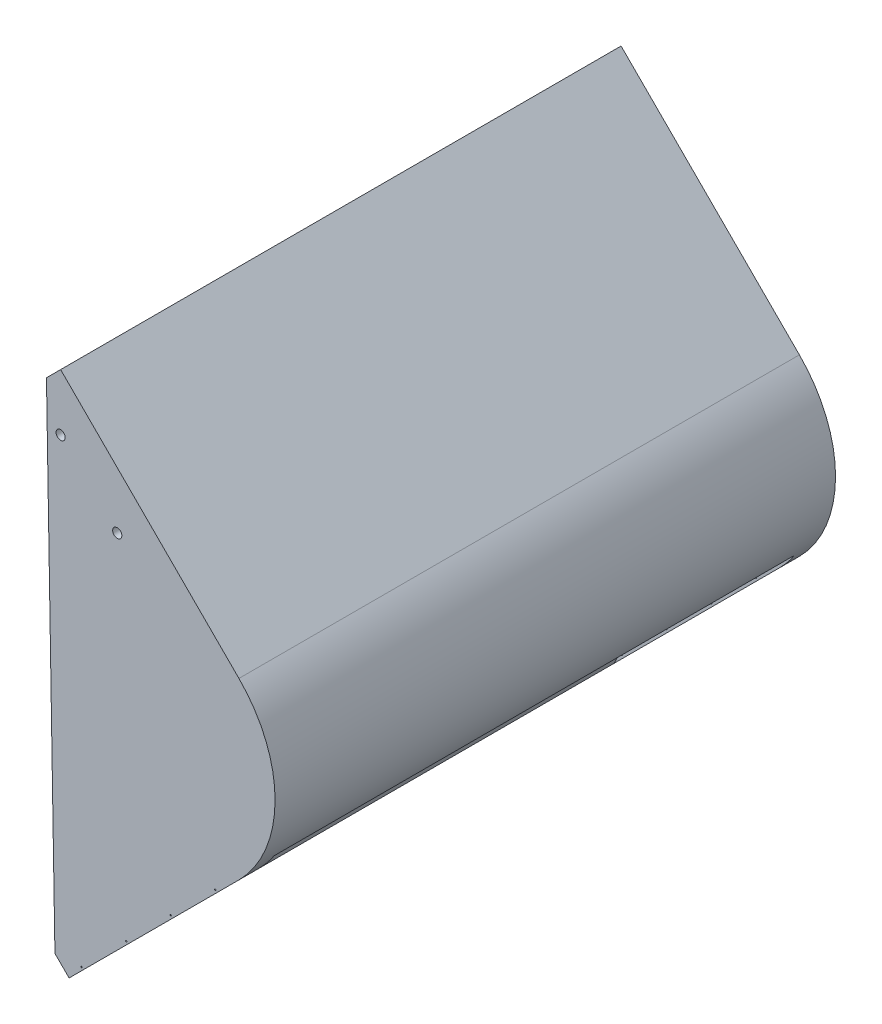
ISO-10303-21;
HEADER;
FILE_DESCRIPTION(('STEP AP214'),'2;1');
FILE_NAME('part.step','',(''),(''),'','','');
FILE_SCHEMA(('AUTOMOTIVE_DESIGN { 1 0 10303 214 1 1 1 1 }'));
ENDSEC;
DATA;
#1=APPLICATION_CONTEXT('core data for automotive mechanical design processes');
#2=APPLICATION_PROTOCOL_DEFINITION('international standard','automotive_design',2000,#1);
#3=PRODUCT_CONTEXT('',#1,'mechanical');
#4=PRODUCT('Part','Part','',(#3));
#5=PRODUCT_RELATED_PRODUCT_CATEGORY('part','',(#4));
#6=PRODUCT_DEFINITION_FORMATION('','',#4);
#7=PRODUCT_DEFINITION_CONTEXT('part definition',#1,'design');
#8=PRODUCT_DEFINITION('design','',#6,#7);
#9=PRODUCT_DEFINITION_SHAPE('','',#8);
#10=(LENGTH_UNIT() NAMED_UNIT(*) SI_UNIT(.MILLI.,.METRE.));
#11=(NAMED_UNIT(*) PLANE_ANGLE_UNIT() SI_UNIT($,.RADIAN.));
#12=(NAMED_UNIT(*) SI_UNIT($,.STERADIAN.) SOLID_ANGLE_UNIT());
#13=UNCERTAINTY_MEASURE_WITH_UNIT(LENGTH_MEASURE(1.E-05),#10,'distance_accuracy_value','');
#14=(GEOMETRIC_REPRESENTATION_CONTEXT(3) GLOBAL_UNCERTAINTY_ASSIGNED_CONTEXT((#13)) GLOBAL_UNIT_ASSIGNED_CONTEXT((#10,
#11,#12)) REPRESENTATION_CONTEXT('',''));
#15=CARTESIAN_POINT('',(0.,0.,0.));
#16=DIRECTION('',(0.,0.,1.));
#17=DIRECTION('',(1.,0.,0.));
#18=AXIS2_PLACEMENT_3D('',#15,#16,#17);
#19=CARTESIAN_POINT('',(-4.49012806053454,-37.9632412700599,177.8));
#20=DIRECTION('',(0.707106781186544,-0.707106781186551,0.));
#21=DIRECTION('',(0.707106781186551,0.707106781186544,0.));
#22=AXIS2_PLACEMENT_3D('',#19,#20,#21);
#23=PLANE('',#22);
#24=DIRECTION('',(0.,0.,1.));
#25=VECTOR('',#24,1.);
#26=CARTESIAN_POINT('',(-56.9574512245767,-90.4305644341015,177.8));
#27=LINE('',#26,#25);
#28=CARTESIAN_POINT('',(-56.9574512245767,-90.4305644341015,6.35));
#29=VERTEX_POINT('',#28);
#30=CARTESIAN_POINT('',(-56.9574512245767,-90.4305644341015,171.45));
#31=VERTEX_POINT('',#30);
#32=EDGE_CURVE('E177',#29,#31,#27,.T.);
#33=ORIENTED_EDGE('',*,*,#32,.F.);
#34=DIRECTION('',(0.707106781186551,0.707106781186544,0.));
#35=VECTOR('',#34,1.);
#36=CARTESIAN_POINT('',(16.7365566047627,-16.7365566047629,6.35));
#37=LINE('',#36,#35);
#38=CARTESIAN_POINT('',(-58.3716647869498,-91.8447779964745,6.34999999999999));
#39=VERTEX_POINT('',#38);
#40=EDGE_CURVE('E249',#39,#29,#37,.T.);
#41=ORIENTED_EDGE('',*,*,#40,.F.);
#42=DIRECTION('',(0.,0.,-1.));
#43=VECTOR('',#42,1.);
#44=CARTESIAN_POINT('',(-58.3716647869498,-91.8447779964745,177.8));
#45=LINE('',#44,#43);
#46=CARTESIAN_POINT('',(-58.3716647869498,-91.8447779964746,171.45));
#47=VERTEX_POINT('',#46);
#48=EDGE_CURVE('E290',#47,#39,#45,.T.);
#49=ORIENTED_EDGE('',*,*,#48,.F.);
#50=DIRECTION('',(-0.707106781186551,-0.707106781186544,0.));
#51=VECTOR('',#50,1.);
#52=CARTESIAN_POINT('',(16.7365566047627,-16.7365566047629,171.45));
#53=LINE('',#52,#51);
#54=EDGE_CURVE('E235',#31,#47,#53,.T.);
#55=ORIENTED_EDGE('',*,*,#54,.F.);
#56=EDGE_LOOP('',(#33,#41,#49,#55));
#57=FACE_BOUND('',#56,.T.);
#58=ADVANCED_FACE('F55',(#57),#23,.F.);
#59=CARTESIAN_POINT('',(-4.49012806053455,8.42259908701405,177.8));
#60=DIRECTION('',(0.707106781186544,0.707106781186551,0.));
#61=DIRECTION('',(-0.707106781186551,0.707106781186544,0.));
#62=AXIS2_PLACEMENT_3D('',#59,#60,#61);
#63=PLANE('',#62);
#64=DIRECTION('',(0.707106781186551,-0.707106781186544,0.));
#65=VECTOR('',#64,1.);
#66=CARTESIAN_POINT('',(1.96623551323978,1.9662355132398,171.45));
#67=LINE('',#66,#65);
#68=CARTESIAN_POINT('',(-61.0586705554587,64.9911415819376,171.45));
#69=VERTEX_POINT('',#68);
#70=CARTESIAN_POINT('',(-4.49012806053454,8.42259908701405,171.45));
#71=VERTEX_POINT('',#70);
#72=EDGE_CURVE('E231',#69,#71,#67,.T.);
#73=ORIENTED_EDGE('',*,*,#72,.F.);
#74=DIRECTION('',(0.,0.,-1.));
#75=VECTOR('',#74,1.);
#76=CARTESIAN_POINT('',(-61.0586705554587,64.9911415819376,177.8));
#77=LINE('',#76,#75);
#78=CARTESIAN_POINT('',(-61.0586705554587,64.9911415819376,6.34999999999999));
#79=VERTEX_POINT('',#78);
#80=EDGE_CURVE('E80',#69,#79,#77,.T.);
#81=ORIENTED_EDGE('',*,*,#80,.T.);
#82=DIRECTION('',(-0.707106781186551,0.707106781186544,0.));
#83=VECTOR('',#82,1.);
#84=CARTESIAN_POINT('',(1.96623551323978,1.9662355132398,6.35));
#85=LINE('',#84,#83);
#86=CARTESIAN_POINT('',(-4.49012806053454,8.42259908701405,6.34999999999999));
#87=VERTEX_POINT('',#86);
#88=EDGE_CURVE('E244',#87,#79,#85,.T.);
#89=ORIENTED_EDGE('',*,*,#88,.F.);
#90=DIRECTION('',(0.,0.,-1.));
#91=VECTOR('',#90,1.);
#92=CARTESIAN_POINT('',(-4.49012806053454,8.42259908701405,177.8));
#93=LINE('',#92,#91);
#94=EDGE_CURVE('E294',#71,#87,#93,.T.);
#95=ORIENTED_EDGE('',*,*,#94,.F.);
#96=EDGE_LOOP('',(#73,#81,#89,#95));
#97=FACE_BOUND('',#96,.T.);
#98=ADVANCED_FACE('F361',(#97),#63,.F.);
#99=CARTESIAN_POINT('',(-27.6830482390713,-14.7703210915229,177.8));
#100=DIRECTION('',(0.,0.,-1.));
#101=DIRECTION('',(-1.,0.,0.));
#102=AXIS2_PLACEMENT_3D('',#99,#100,#101);
#103=CYLINDRICAL_SURFACE('',#102,32.7997422675235);
#104=CARTESIAN_POINT('',(-27.6830482390713,-14.7703210915229,6.35));
#105=DIRECTION('',(0.,0.,-1.));
#106=DIRECTION('',(-1.,0.,0.));
#107=AXIS2_PLACEMENT_3D('',#104,#105,#106);
#108=CIRCLE('',#107,32.7997422675235);
#109=CARTESIAN_POINT('',(0.263459682228906,-31.9405216675404,6.35000000000002));
#110=VERTEX_POINT('',#109);
#111=EDGE_CURVE('E247',#110,#87,#108,.F.);
#112=ORIENTED_EDGE('',*,*,#111,.F.);
#113=DIRECTION('',(0.,0.,-1.));
#114=VECTOR('',#113,1.);
#115=CARTESIAN_POINT('',(0.263459682228902,-31.9405216675404,177.8));
#116=LINE('',#115,#114);
#117=CARTESIAN_POINT('',(0.263459682228906,-31.9405216675404,171.45));
#118=VERTEX_POINT('',#117);
#119=EDGE_CURVE('E222',#110,#118,#116,.F.);
#120=ORIENTED_EDGE('',*,*,#119,.T.);
#121=CARTESIAN_POINT('',(-27.6830482390713,-14.7703210915229,171.45));
#122=DIRECTION('',(0.,0.,1.));
#123=DIRECTION('',(1.,0.,0.));
#124=AXIS2_PLACEMENT_3D('',#121,#122,#123);
#125=CIRCLE('',#124,32.7997422675235);
#126=EDGE_CURVE('E237',#71,#118,#125,.F.);
#127=ORIENTED_EDGE('',*,*,#126,.F.);
#128=ORIENTED_EDGE('',*,*,#94,.T.);
#129=EDGE_LOOP('',(#112,#120,#127,#128));
#130=FACE_BOUND('',#129,.T.);
#131=ADVANCED_FACE('F406',(#130),#103,.F.);
#132=CARTESIAN_POINT('',(-27.6830482390713,-14.7703210915229,177.8));
#133=DIRECTION('',(0.,0.,-1.));
#134=DIRECTION('',(-1.,0.,0.));
#135=AXIS2_PLACEMENT_3D('',#132,#133,#134);
#136=CYLINDRICAL_SURFACE('',#135,39.1497422675235);
#137=DIRECTION('',(0.,0.,-1.));
#138=VECTOR('',#137,1.);
#139=CARTESIAN_POINT('',(0.,-42.4533693305945,177.8));
#140=LINE('',#139,#138);
#141=CARTESIAN_POINT('',(0.,-42.4533693305945,177.8));
#142=VERTEX_POINT('',#141);
#143=CARTESIAN_POINT('',(0.,-42.4533693305945,171.45));
#144=VERTEX_POINT('',#143);
#145=EDGE_CURVE('E284',#142,#144,#140,.T.);
#146=ORIENTED_EDGE('',*,*,#145,.T.);
#147=CARTESIAN_POINT('',(-27.6830482390713,-14.7703210915229,171.45));
#148=DIRECTION('',(0.,0.,1.));
#149=DIRECTION('',(1.,0.,0.));
#150=AXIS2_PLACEMENT_3D('',#147,#148,#149);
#151=CIRCLE('',#150,39.1497422675235);
#152=CARTESIAN_POINT('',(4.85872323685288,-36.5357852221644,171.45));
#153=VERTEX_POINT('',#152);
#154=EDGE_CURVE('E225',#144,#153,#151,.T.);
#155=ORIENTED_EDGE('',*,*,#154,.T.);
#156=DIRECTION('',(0.,0.,-1.));
#157=VECTOR('',#156,1.);
#158=CARTESIAN_POINT('',(4.85872323685288,-36.5357852221644,177.8));
#159=LINE('',#158,#157);
#160=CARTESIAN_POINT('',(4.85872323685288,-36.5357852221644,6.35000000000002));
#161=VERTEX_POINT('',#160);
#162=EDGE_CURVE('E219',#153,#161,#159,.T.);
#163=ORIENTED_EDGE('',*,*,#162,.T.);
#164=CARTESIAN_POINT('',(-27.6830482390713,-14.7703210915229,6.35000000000002));
#165=DIRECTION('',(0.,0.,1.));
#166=DIRECTION('',(1.,0.,0.));
#167=AXIS2_PLACEMENT_3D('',#164,#165,#166);
#168=CIRCLE('',#167,39.1497422675235);
#169=CARTESIAN_POINT('',(0.,-42.4533693305945,6.35000000000002));
#170=VERTEX_POINT('',#169);
#171=EDGE_CURVE('E228',#170,#161,#168,.T.);
#172=ORIENTED_EDGE('',*,*,#171,.F.);
#173=CARTESIAN_POINT('',(0.,-42.4533693305945,0.));
#174=VERTEX_POINT('',#173);
#175=EDGE_CURVE('E273',#170,#174,#140,.T.);
#176=ORIENTED_EDGE('',*,*,#175,.T.);
#177=CARTESIAN_POINT('',(-27.6830482390713,-14.7703210915229,0.));
#178=DIRECTION('',(0.,0.,1.));
#179=DIRECTION('',(-1.,0.,0.));
#180=AXIS2_PLACEMENT_3D('',#177,#178,#179);
#181=CIRCLE('',#180,39.1497422675235);
#182=CARTESIAN_POINT('',(0.,12.9127271475487,0.));
#183=VERTEX_POINT('',#182);
#184=EDGE_CURVE('E257',#174,#183,#181,.T.);
#185=ORIENTED_EDGE('',*,*,#184,.T.);
#186=DIRECTION('',(0.,0.,-1.));
#187=VECTOR('',#186,1.);
#188=CARTESIAN_POINT('',(0.,12.9127271475487,177.8));
#189=LINE('',#188,#187);
#190=CARTESIAN_POINT('',(0.,12.9127271475487,177.8));
#191=VERTEX_POINT('',#190);
#192=EDGE_CURVE('E13',#191,#183,#189,.T.);
#193=ORIENTED_EDGE('',*,*,#192,.F.);
#194=CARTESIAN_POINT('',(-27.6830482390713,-14.7703210915229,177.8));
#195=DIRECTION('',(0.,0.,1.));
#196=DIRECTION('',(-1.,0.,0.));
#197=AXIS2_PLACEMENT_3D('',#194,#195,#196);
#198=CIRCLE('',#197,39.1497422675235);
#199=EDGE_CURVE('E260',#142,#191,#198,.T.);
#200=ORIENTED_EDGE('',*,*,#199,.F.);
#201=EDGE_LOOP('',(#146,#155,#163,#172,#176,#185,#193,#200));
#202=FACE_BOUND('',#201,.T.);
#203=ADVANCED_FACE('F57',(#202),#136,.T.);
#204=CARTESIAN_POINT('',(0.,12.9127271475487,177.8));
#205=DIRECTION('',(-0.707106781186544,-0.707106781186551,0.));
#206=DIRECTION('',(0.707106781186551,-0.707106781186544,0.));
#207=AXIS2_PLACEMENT_3D('',#204,#205,#206);
#208=PLANE('',#207);
#209=DIRECTION('',(-0.707106781186552,0.707106781186544,0.));
#210=VECTOR('',#209,1.);
#211=CARTESIAN_POINT('',(0.,12.9127271475487,0.));
#212=LINE('',#211,#210);
#213=CARTESIAN_POINT('',(-56.5685424949241,69.4812696424722,0.));
#214=VERTEX_POINT('',#213);
#215=EDGE_CURVE('E276',#183,#214,#212,.T.);
#216=ORIENTED_EDGE('',*,*,#215,.T.);
#217=DIRECTION('',(0.,0.,-1.));
#218=VECTOR('',#217,1.);
#219=CARTESIAN_POINT('',(-56.5685424949241,69.4812696424722,177.8));
#220=LINE('',#219,#218);
#221=CARTESIAN_POINT('',(-56.5685424949241,69.4812696424722,177.8));
#222=VERTEX_POINT('',#221);
#223=EDGE_CURVE('E64',#222,#214,#220,.T.);
#224=ORIENTED_EDGE('',*,*,#223,.F.);
#225=DIRECTION('',(-0.707106781186552,0.707106781186544,0.));
#226=VECTOR('',#225,1.);
#227=CARTESIAN_POINT('',(0.,12.9127271475487,177.8));
#228=LINE('',#227,#226);
#229=EDGE_CURVE('E263',#191,#222,#228,.T.);
#230=ORIENTED_EDGE('',*,*,#229,.F.);
#231=ORIENTED_EDGE('',*,*,#192,.T.);
#232=EDGE_LOOP('',(#216,#224,#230,#231));
#233=FACE_BOUND('',#232,.T.);
#234=ADVANCED_FACE('F415',(#233),#208,.F.);
#235=CARTESIAN_POINT('',(-61.0586705554587,64.9911415819376,177.8));
#236=DIRECTION('',(0.70710678118655,-0.707106781186545,0.));
#237=DIRECTION('',(0.707106781186545,0.70710678118655,0.));
#238=AXIS2_PLACEMENT_3D('',#235,#236,#237);
#239=PLANE('',#238);
#240=DIRECTION('',(-0.707106781186545,-0.70710678118655,0.));
#241=VECTOR('',#240,1.);
#242=CARTESIAN_POINT('',(-61.0586705554587,64.9911415819376,0.));
#243=LINE('',#242,#241);
#244=CARTESIAN_POINT('',(-61.0586705554587,64.9911415819376,0.));
#245=VERTEX_POINT('',#244);
#246=EDGE_CURVE('E278',#214,#245,#243,.T.);
#247=ORIENTED_EDGE('',*,*,#246,.T.);
#248=DIRECTION('',(0.,0.,-1.));
#249=VECTOR('',#248,1.);
#250=CARTESIAN_POINT('',(-61.0586705554587,64.9911415819376,6.35));
#251=LINE('',#250,#249);
#252=EDGE_CURVE('E252',#79,#245,#251,.T.);
#253=ORIENTED_EDGE('',*,*,#252,.F.);
#254=ORIENTED_EDGE('',*,*,#80,.F.);
#255=CARTESIAN_POINT('',(-61.0586705554587,64.9911415819376,177.8));
#256=VERTEX_POINT('',#255);
#257=EDGE_CURVE('E297',#256,#69,#77,.T.);
#258=ORIENTED_EDGE('',*,*,#257,.F.);
#259=DIRECTION('',(-0.707106781186545,-0.70710678118655,0.));
#260=VECTOR('',#259,1.);
#261=CARTESIAN_POINT('',(-61.0586705554587,64.9911415819376,177.8));
#262=LINE('',#261,#260);
#263=EDGE_CURVE('E266',#222,#256,#262,.T.);
#264=ORIENTED_EDGE('',*,*,#263,.F.);
#265=ORIENTED_EDGE('',*,*,#223,.T.);
#266=EDGE_LOOP('',(#247,#253,#254,#258,#264,#265));
#267=FACE_BOUND('',#266,.T.);
#268=ADVANCED_FACE('F364',(#267),#239,.F.);
#269=CARTESIAN_POINT('',(-58.3716647869498,-91.8447779964745,177.8));
#270=DIRECTION('',(0.707106781186551,0.707106781186544,0.));
#271=DIRECTION('',(-0.707106781186544,0.707106781186551,0.));
#272=AXIS2_PLACEMENT_3D('',#269,#270,#271);
#273=PLANE('',#272);
#274=DIRECTION('',(0.707106781186544,-0.707106781186551,0.));
#275=VECTOR('',#274,1.);
#276=CARTESIAN_POINT('',(-58.3716647869498,-91.8447779964745,0.));
#277=LINE('',#276,#275);
#278=CARTESIAN_POINT('',(-58.3716647869498,-91.8447779964745,0.));
#279=VERTEX_POINT('',#278);
#280=CARTESIAN_POINT('',(-53.8815367264152,-96.3349060570091,0.));
#281=VERTEX_POINT('',#280);
#282=EDGE_CURVE('E280',#279,#281,#277,.T.);
#283=ORIENTED_EDGE('',*,*,#282,.T.);
#284=DIRECTION('',(0.,0.,-1.));
#285=VECTOR('',#284,1.);
#286=CARTESIAN_POINT('',(-53.8815367264152,-96.3349060570091,177.8));
#287=LINE('',#286,#285);
#288=CARTESIAN_POINT('',(-53.8815367264152,-96.3349060570091,177.8));
#289=VERTEX_POINT('',#288);
#290=EDGE_CURVE('E287',#289,#281,#287,.T.);
#291=ORIENTED_EDGE('',*,*,#290,.F.);
#292=DIRECTION('',(0.707106781186544,-0.707106781186551,0.));
#293=VECTOR('',#292,1.);
#294=CARTESIAN_POINT('',(-58.3716647869498,-91.8447779964745,177.8));
#295=LINE('',#294,#293);
#296=CARTESIAN_POINT('',(-58.3716647869498,-91.8447779964745,177.8));
#297=VERTEX_POINT('',#296);
#298=EDGE_CURVE('E269',#297,#289,#295,.T.);
#299=ORIENTED_EDGE('',*,*,#298,.F.);
#300=EDGE_CURVE('E291',#297,#47,#45,.T.);
#301=ORIENTED_EDGE('',*,*,#300,.T.);
#302=ORIENTED_EDGE('',*,*,#48,.T.);
#303=DIRECTION('',(0.,0.,-1.));
#304=VECTOR('',#303,1.);
#305=CARTESIAN_POINT('',(-58.3716647869498,-91.8447779964746,6.35));
#306=LINE('',#305,#304);
#307=EDGE_CURVE('E255',#39,#279,#306,.T.);
#308=ORIENTED_EDGE('',*,*,#307,.T.);
#309=EDGE_LOOP('',(#283,#291,#299,#301,#302,#308));
#310=FACE_BOUND('',#309,.T.);
#311=ADVANCED_FACE('F375',(#310),#273,.F.);
#312=CARTESIAN_POINT('',(0.,-42.4533693305945,177.8));
#313=DIRECTION('',(-0.707106781186544,0.707106781186551,0.));
#314=DIRECTION('',(-0.707106781186551,-0.707106781186544,0.));
#315=AXIS2_PLACEMENT_3D('',#312,#313,#314);
#316=PLANE('',#315);
#317=DIRECTION('',(0.,0.,1.));
#318=VECTOR('',#317,1.);
#319=CARTESIAN_POINT('',(-52.4673231640421,-94.9206924946361,6.35000000000001));
#320=LINE('',#319,#318);
#321=CARTESIAN_POINT('',(-52.4673231640421,-94.9206924946361,6.35));
#322=VERTEX_POINT('',#321);
#323=CARTESIAN_POINT('',(-52.4673231640421,-94.9206924946361,171.45));
#324=VERTEX_POINT('',#323);
#325=EDGE_CURVE('E206',#322,#324,#320,.T.);
#326=ORIENTED_EDGE('',*,*,#325,.T.);
#327=DIRECTION('',(-0.707106781186551,-0.707106781186544,0.));
#328=VECTOR('',#327,1.);
#329=CARTESIAN_POINT('',(5.38815367264153,-37.0652156579531,171.45));
#330=LINE('',#329,#328);
#331=EDGE_CURVE('E202',#144,#324,#330,.T.);
#332=ORIENTED_EDGE('',*,*,#331,.F.);
#333=ORIENTED_EDGE('',*,*,#145,.F.);
#334=DIRECTION('',(0.707106781186551,0.707106781186544,0.));
#335=VECTOR('',#334,1.);
#336=CARTESIAN_POINT('',(0.,-42.4533693305945,177.8));
#337=LINE('',#336,#335);
#338=EDGE_CURVE('E271',#289,#142,#337,.T.);
#339=ORIENTED_EDGE('',*,*,#338,.F.);
#340=ORIENTED_EDGE('',*,*,#290,.T.);
#341=DIRECTION('',(0.707106781186551,0.707106781186544,0.));
#342=VECTOR('',#341,1.);
#343=CARTESIAN_POINT('',(0.,-42.4533693305945,0.));
#344=LINE('',#343,#342);
#345=EDGE_CURVE('E264',#281,#174,#344,.T.);
#346=ORIENTED_EDGE('',*,*,#345,.T.);
#347=ORIENTED_EDGE('',*,*,#175,.F.);
#348=DIRECTION('',(-0.707106781186551,-0.707106781186544,0.));
#349=VECTOR('',#348,1.);
#350=CARTESIAN_POINT('',(5.38815367264153,-37.0652156579531,6.35000000000002));
#351=LINE('',#350,#349);
#352=EDGE_CURVE('E209',#170,#322,#351,.T.);
#353=ORIENTED_EDGE('',*,*,#352,.T.);
#354=EDGE_LOOP('',(#326,#332,#333,#339,#340,#346,#347,#353));
#355=FACE_BOUND('',#354,.T.);
#356=ADVANCED_FACE('F383',(#355),#316,.F.);
#357=CARTESIAN_POINT('',(-27.6830482390713,-14.7703210915229,177.8));
#358=DIRECTION('',(0.,0.,-1.));
#359=DIRECTION('',(-1.,0.,0.));
#360=AXIS2_PLACEMENT_3D('',#357,#358,#359);
#361=PLANE('',#360);
#362=CARTESIAN_POINT('',(-49.9302240331447,-91.3059626292104,177.8));
#363=DIRECTION('',(0.,0.,-1.));
#364=DIRECTION('',(-1.,0.,0.));
#365=AXIS2_PLACEMENT_3D('',#362,#363,#364);
#366=CIRCLE('',#365,0.215899999999996);
#367=CARTESIAN_POINT('',(-50.1461240331447,-91.3059626292104,177.8));
#368=VERTEX_POINT('',#367);
#369=EDGE_CURVE('E314',#368,#368,#366,.T.);
#370=ORIENTED_EDGE('',*,*,#369,.T.);
#371=EDGE_LOOP('',(#370));
#372=FACE_BOUND('',#371,.T.);
#373=CARTESIAN_POINT('',(-35.7880884956808,-77.1638270917465,177.8));
#374=DIRECTION('',(0.,0.,-1.));
#375=DIRECTION('',(-1.,0.,0.));
#376=AXIS2_PLACEMENT_3D('',#373,#374,#375);
#377=CIRCLE('',#376,0.215899999999996);
#378=CARTESIAN_POINT('',(-36.0039884956808,-77.1638270917465,177.8));
#379=VERTEX_POINT('',#378);
#380=EDGE_CURVE('E630',#379,#379,#377,.T.);
#381=ORIENTED_EDGE('',*,*,#380,.T.);
#382=EDGE_LOOP('',(#381));
#383=FACE_BOUND('',#382,.T.);
#384=CARTESIAN_POINT('',(-21.6459528719499,-63.0216914680155,177.8));
#385=DIRECTION('',(0.,0.,-1.));
#386=DIRECTION('',(-1.,0.,0.));
#387=AXIS2_PLACEMENT_3D('',#384,#385,#386);
#388=CIRCLE('',#387,0.215899999999992);
#389=CARTESIAN_POINT('',(-21.8618528719499,-63.0216914680155,177.8));
#390=VERTEX_POINT('',#389);
#391=EDGE_CURVE('E640',#390,#390,#388,.T.);
#392=ORIENTED_EDGE('',*,*,#391,.T.);
#393=EDGE_LOOP('',(#392));
#394=FACE_BOUND('',#393,.T.);
#395=CARTESIAN_POINT('',(-7.50381724821891,-48.8795558442846,177.8));
#396=DIRECTION('',(0.,0.,-1.));
#397=DIRECTION('',(-1.,0.,0.));
#398=AXIS2_PLACEMENT_3D('',#395,#396,#397);
#399=CIRCLE('',#398,0.215899999999991);
#400=CARTESIAN_POINT('',(-7.7197172482189,-48.8795558442846,177.8));
#401=VERTEX_POINT('',#400);
#402=EDGE_CURVE('E646',#401,#401,#399,.T.);
#403=ORIENTED_EDGE('',*,*,#402,.T.);
#404=EDGE_LOOP('',(#403));
#405=FACE_BOUND('',#404,.T.);
#406=CARTESIAN_POINT('',(-56.5685424949238,51.5207574003342,177.8));
#407=DIRECTION('',(0.,0.,-1.));
#408=DIRECTION('',(-1.,0.,0.));
#409=AXIS2_PLACEMENT_3D('',#406,#407,#408);
#410=CIRCLE('',#409,1.4605);
#411=CARTESIAN_POINT('',(-58.0290424949238,51.5207574003342,177.8));
#412=VERTEX_POINT('',#411);
#413=EDGE_CURVE('E194',#412,#412,#410,.T.);
#414=ORIENTED_EDGE('',*,*,#413,.T.);
#415=EDGE_LOOP('',(#414));
#416=FACE_BOUND('',#415,.T.);
#417=CARTESIAN_POINT('',(-38.6080302527855,33.5602451581959,177.8));
#418=DIRECTION('',(0.,0.,-1.));
#419=DIRECTION('',(-1.,0.,0.));
#420=AXIS2_PLACEMENT_3D('',#417,#418,#419);
#421=CIRCLE('',#420,1.46050000000001);
#422=CARTESIAN_POINT('',(-40.0685302527855,33.5602451581959,177.8));
#423=VERTEX_POINT('',#422);
#424=EDGE_CURVE('E309',#423,#423,#421,.T.);
#425=ORIENTED_EDGE('',*,*,#424,.T.);
#426=EDGE_LOOP('',(#425));
#427=FACE_BOUND('',#426,.T.);
#428=ORIENTED_EDGE('',*,*,#199,.T.);
#429=ORIENTED_EDGE('',*,*,#229,.T.);
#430=ORIENTED_EDGE('',*,*,#263,.T.);
#431=DIRECTION('',(0.0171300777902363,-0.999853269452524,0.));
#432=VECTOR('',#431,1.);
#433=CARTESIAN_POINT('',(-59.9276135703548,-1.02671533274627,177.8));
#434=LINE('',#433,#432);
#435=EDGE_CURVE('E230',#256,#297,#434,.T.);
#436=ORIENTED_EDGE('',*,*,#435,.T.);
#437=ORIENTED_EDGE('',*,*,#298,.T.);
#438=ORIENTED_EDGE('',*,*,#338,.T.);
#439=EDGE_LOOP('',(#428,#429,#430,#436,#437,#438));
#440=FACE_BOUND('',#439,.T.);
#441=ADVANCED_FACE('F388',(#372,#383,#394,#405,#416,#427,#440),#361,.F.);
#442=CARTESIAN_POINT('',(-27.6830482390713,-14.7703210915229,0.));
#443=DIRECTION('',(0.,0.,-1.));
#444=DIRECTION('',(-1.,0.,0.));
#445=AXIS2_PLACEMENT_3D('',#442,#443,#444);
#446=PLANE('',#445);
#447=CARTESIAN_POINT('',(-49.9302240331447,-91.3059626292104,0.));
#448=DIRECTION('',(0.,0.,-1.));
#449=DIRECTION('',(-1.,0.,0.));
#450=AXIS2_PLACEMENT_3D('',#447,#448,#449);
#451=CIRCLE('',#450,0.215899999999996);
#452=CARTESIAN_POINT('',(-50.1461240331447,-91.3059626292104,0.));
#453=VERTEX_POINT('',#452);
#454=EDGE_CURVE('E615',#453,#453,#451,.T.);
#455=ORIENTED_EDGE('',*,*,#454,.F.);
#456=EDGE_LOOP('',(#455));
#457=FACE_BOUND('',#456,.T.);
#458=CARTESIAN_POINT('',(-35.7880884956808,-77.1638270917465,0.));
#459=DIRECTION('',(0.,0.,-1.));
#460=DIRECTION('',(-1.,0.,0.));
#461=AXIS2_PLACEMENT_3D('',#458,#459,#460);
#462=CIRCLE('',#461,0.215899999999996);
#463=CARTESIAN_POINT('',(-36.0039884956808,-77.1638270917465,0.));
#464=VERTEX_POINT('',#463);
#465=EDGE_CURVE('E635',#464,#464,#462,.T.);
#466=ORIENTED_EDGE('',*,*,#465,.F.);
#467=EDGE_LOOP('',(#466));
#468=FACE_BOUND('',#467,.T.);
#469=CARTESIAN_POINT('',(-21.6459528719499,-63.0216914680155,0.));
#470=DIRECTION('',(0.,0.,-1.));
#471=DIRECTION('',(-1.,0.,0.));
#472=AXIS2_PLACEMENT_3D('',#469,#470,#471);
#473=CIRCLE('',#472,0.215899999999992);
#474=CARTESIAN_POINT('',(-21.8618528719499,-63.0216914680155,0.));
#475=VERTEX_POINT('',#474);
#476=EDGE_CURVE('E643',#475,#475,#473,.T.);
#477=ORIENTED_EDGE('',*,*,#476,.F.);
#478=EDGE_LOOP('',(#477));
#479=FACE_BOUND('',#478,.T.);
#480=CARTESIAN_POINT('',(-7.50381724821891,-48.8795558442846,0.));
#481=DIRECTION('',(0.,0.,-1.));
#482=DIRECTION('',(-1.,0.,0.));
#483=AXIS2_PLACEMENT_3D('',#480,#481,#482);
#484=CIRCLE('',#483,0.215899999999991);
#485=CARTESIAN_POINT('',(-7.7197172482189,-48.8795558442846,0.));
#486=VERTEX_POINT('',#485);
#487=EDGE_CURVE('E648',#486,#486,#484,.T.);
#488=ORIENTED_EDGE('',*,*,#487,.F.);
#489=EDGE_LOOP('',(#488));
#490=FACE_BOUND('',#489,.T.);
#491=CARTESIAN_POINT('',(-56.5685424949238,51.5207574003342,0.));
#492=DIRECTION('',(0.,0.,1.));
#493=DIRECTION('',(1.,0.,0.));
#494=AXIS2_PLACEMENT_3D('',#491,#492,#493);
#495=CIRCLE('',#494,1.4605);
#496=CARTESIAN_POINT('',(-55.1080424949238,51.5207574003342,0.));
#497=VERTEX_POINT('',#496);
#498=EDGE_CURVE('E305',#497,#497,#495,.T.);
#499=ORIENTED_EDGE('',*,*,#498,.T.);
#500=EDGE_LOOP('',(#499));
#501=FACE_BOUND('',#500,.T.);
#502=CARTESIAN_POINT('',(-38.6080302527855,33.5602451581959,0.));
#503=DIRECTION('',(0.,0.,1.));
#504=DIRECTION('',(1.,0.,0.));
#505=AXIS2_PLACEMENT_3D('',#502,#503,#504);
#506=CIRCLE('',#505,1.46050000000001);
#507=CARTESIAN_POINT('',(-37.1475302527855,33.5602451581959,0.));
#508=VERTEX_POINT('',#507);
#509=EDGE_CURVE('E335',#508,#508,#506,.T.);
#510=ORIENTED_EDGE('',*,*,#509,.T.);
#511=EDGE_LOOP('',(#510));
#512=FACE_BOUND('',#511,.T.);
#513=ORIENTED_EDGE('',*,*,#282,.F.);
#514=DIRECTION('',(0.0171300777902363,-0.999853269452524,0.));
#515=VECTOR('',#514,1.);
#516=CARTESIAN_POINT('',(-59.9276135703548,-1.02671533274627,0.));
#517=LINE('',#516,#515);
#518=EDGE_CURVE('E240',#245,#279,#517,.T.);
#519=ORIENTED_EDGE('',*,*,#518,.F.);
#520=ORIENTED_EDGE('',*,*,#246,.F.);
#521=ORIENTED_EDGE('',*,*,#215,.F.);
#522=ORIENTED_EDGE('',*,*,#184,.F.);
#523=ORIENTED_EDGE('',*,*,#345,.F.);
#524=EDGE_LOOP('',(#513,#519,#520,#521,#522,#523));
#525=FACE_BOUND('',#524,.T.);
#526=ADVANCED_FACE('F379',(#457,#468,#479,#490,#501,#512,#525),#446,.T.);
#527=CARTESIAN_POINT('',(-59.9276135703548,-1.02671533274627,6.35));
#528=DIRECTION('',(0.999853269452524,0.0171300777902363,0.));
#529=DIRECTION('',(-0.0171300777902363,0.999853269452524,0.));
#530=AXIS2_PLACEMENT_3D('',#527,#528,#529);
#531=PLANE('',#530);
#532=ORIENTED_EDGE('',*,*,#518,.T.);
#533=ORIENTED_EDGE('',*,*,#307,.F.);
#534=DIRECTION('',(0.0171300777902363,-0.999853269452524,0.));
#535=VECTOR('',#534,1.);
#536=CARTESIAN_POINT('',(-59.9276135703548,-1.02671533274627,6.35));
#537=LINE('',#536,#535);
#538=EDGE_CURVE('E242',#79,#39,#537,.T.);
#539=ORIENTED_EDGE('',*,*,#538,.F.);
#540=ORIENTED_EDGE('',*,*,#252,.T.);
#541=EDGE_LOOP('',(#532,#533,#539,#540));
#542=FACE_BOUND('',#541,.T.);
#543=ADVANCED_FACE('F372',(#542),#531,.F.);
#544=CARTESIAN_POINT('',(0.,0.,6.35));
#545=DIRECTION('',(0.,0.,-1.));
#546=DIRECTION('',(-1.,0.,0.));
#547=AXIS2_PLACEMENT_3D('',#544,#545,#546);
#548=PLANE('',#547);
#549=CARTESIAN_POINT('',(-49.9302240331447,-91.3059626292104,6.34999999999999));
#550=DIRECTION('',(0.,0.,-1.));
#551=DIRECTION('',(-1.,0.,0.));
#552=AXIS2_PLACEMENT_3D('',#549,#550,#551);
#553=CIRCLE('',#552,0.215899999999996);
#554=CARTESIAN_POINT('',(-50.1461240331447,-91.3059626292104,6.34999999999999));
#555=VERTEX_POINT('',#554);
#556=EDGE_CURVE('E332',#555,#555,#553,.T.);
#557=ORIENTED_EDGE('',*,*,#556,.T.);
#558=EDGE_LOOP('',(#557));
#559=FACE_BOUND('',#558,.T.);
#560=CARTESIAN_POINT('',(-35.7880884956808,-77.1638270917465,6.34999999999999));
#561=DIRECTION('',(0.,0.,-1.));
#562=DIRECTION('',(-1.,0.,0.));
#563=AXIS2_PLACEMENT_3D('',#560,#561,#562);
#564=CIRCLE('',#563,0.215899999999996);
#565=CARTESIAN_POINT('',(-36.0039884956808,-77.1638270917465,6.34999999999999));
#566=VERTEX_POINT('',#565);
#567=EDGE_CURVE('E320',#566,#566,#564,.T.);
#568=ORIENTED_EDGE('',*,*,#567,.T.);
#569=EDGE_LOOP('',(#568));
#570=FACE_BOUND('',#569,.T.);
#571=CARTESIAN_POINT('',(-21.6459528719499,-63.0216914680155,6.34999999999999));
#572=DIRECTION('',(0.,0.,-1.));
#573=DIRECTION('',(-1.,0.,0.));
#574=AXIS2_PLACEMENT_3D('',#571,#572,#573);
#575=CIRCLE('',#574,0.215899999999992);
#576=CARTESIAN_POINT('',(-21.8618528719499,-63.0216914680155,6.34999999999999));
#577=VERTEX_POINT('',#576);
#578=EDGE_CURVE('E317',#577,#577,#575,.T.);
#579=ORIENTED_EDGE('',*,*,#578,.T.);
#580=EDGE_LOOP('',(#579));
#581=FACE_BOUND('',#580,.T.);
#582=CARTESIAN_POINT('',(-7.50381724821891,-48.8795558442846,6.34999999999999));
#583=DIRECTION('',(0.,0.,-1.));
#584=DIRECTION('',(-1.,0.,0.));
#585=AXIS2_PLACEMENT_3D('',#582,#583,#584);
#586=CIRCLE('',#585,0.215899999999991);
#587=CARTESIAN_POINT('',(-7.7197172482189,-48.8795558442846,6.34999999999999));
#588=VERTEX_POINT('',#587);
#589=EDGE_CURVE('E313',#588,#588,#586,.T.);
#590=ORIENTED_EDGE('',*,*,#589,.T.);
#591=EDGE_LOOP('',(#590));
#592=FACE_BOUND('',#591,.T.);
#593=CARTESIAN_POINT('',(-56.5685424949238,51.5207574003342,6.35));
#594=DIRECTION('',(0.,0.,-1.));
#595=DIRECTION('',(-1.,0.,0.));
#596=AXIS2_PLACEMENT_3D('',#593,#594,#595);
#597=CIRCLE('',#596,1.4605);
#598=CARTESIAN_POINT('',(-58.0290424949238,51.5207574003342,6.35));
#599=VERTEX_POINT('',#598);
#600=EDGE_CURVE('E198',#599,#599,#597,.T.);
#601=ORIENTED_EDGE('',*,*,#600,.T.);
#602=EDGE_LOOP('',(#601));
#603=FACE_BOUND('',#602,.T.);
#604=CARTESIAN_POINT('',(-38.6080302527855,33.5602451581959,6.35));
#605=DIRECTION('',(0.,0.,-1.));
#606=DIRECTION('',(-1.,0.,0.));
#607=AXIS2_PLACEMENT_3D('',#604,#605,#606);
#608=CIRCLE('',#607,1.46050000000001);
#609=CARTESIAN_POINT('',(-40.0685302527855,33.5602451581959,6.35));
#610=VERTEX_POINT('',#609);
#611=EDGE_CURVE('E304',#610,#610,#608,.T.);
#612=ORIENTED_EDGE('',*,*,#611,.T.);
#613=EDGE_LOOP('',(#612));
#614=FACE_BOUND('',#613,.T.);
#615=ORIENTED_EDGE('',*,*,#40,.T.);
#616=DIRECTION('',(0.45399049973955,0.891006524188366,0.));
#617=VECTOR('',#616,1.);
#618=CARTESIAN_POINT('',(-8.63816881222158,4.40136684685599,6.35));
#619=LINE('',#618,#617);
#620=CARTESIAN_POINT('',(-50.8431458306435,-78.4305644341015,6.35));
#621=VERTEX_POINT('',#620);
#622=EDGE_CURVE('E203',#29,#621,#619,.T.);
#623=ORIENTED_EDGE('',*,*,#622,.T.);
#624=DIRECTION('',(0.707106781186544,-0.707106781186551,0.));
#625=VECTOR('',#624,1.);
#626=CARTESIAN_POINT('',(-64.6368551323727,-64.6368551323721,6.35));
#627=LINE('',#626,#625);
#628=CARTESIAN_POINT('',(-46.3530177701089,-82.9206924946361,6.35));
#629=VERTEX_POINT('',#628);
#630=EDGE_CURVE('E189',#621,#629,#627,.T.);
#631=ORIENTED_EDGE('',*,*,#630,.T.);
#632=DIRECTION('',(0.45399049973955,0.891006524188366,0.));
#633=VECTOR('',#632,1.);
#634=CARTESIAN_POINT('',(-3.25719430056469,1.65962339008593,6.35));
#635=LINE('',#634,#633);
#636=EDGE_CURVE('E191',#322,#629,#635,.T.);
#637=ORIENTED_EDGE('',*,*,#636,.F.);
#638=ORIENTED_EDGE('',*,*,#352,.F.);
#639=ORIENTED_EDGE('',*,*,#171,.T.);
#640=DIRECTION('',(0.707106781186544,-0.707106781186551,0.));
#641=VECTOR('',#640,1.);
#642=CARTESIAN_POINT('',(-81.1085010916209,49.4314391063102,6.35000000000002));
#643=LINE('',#642,#641);
#644=EDGE_CURVE('E212',#110,#161,#643,.T.);
#645=ORIENTED_EDGE('',*,*,#644,.F.);
#646=ORIENTED_EDGE('',*,*,#111,.T.);
#647=ORIENTED_EDGE('',*,*,#88,.T.);
#648=ORIENTED_EDGE('',*,*,#538,.T.);
#649=EDGE_LOOP('',(#615,#623,#631,#637,#638,#639,#645,#646,#647,#648));
#650=FACE_BOUND('',#649,.T.);
#651=ADVANCED_FACE('F350',(#559,#570,#581,#592,#603,#614,#650),#548,.F.);
#652=CARTESIAN_POINT('',(-59.9276135703548,-1.02671533274627,171.45));
#653=DIRECTION('',(-0.999853269452524,-0.0171300777902363,0.));
#654=DIRECTION('',(0.0171300777902363,-0.999853269452524,0.));
#655=AXIS2_PLACEMENT_3D('',#652,#653,#654);
#656=PLANE('',#655);
#657=ORIENTED_EDGE('',*,*,#435,.F.);
#658=ORIENTED_EDGE('',*,*,#257,.T.);
#659=DIRECTION('',(0.0171300777902363,-0.999853269452524,0.));
#660=VECTOR('',#659,1.);
#661=CARTESIAN_POINT('',(-59.9276135703548,-1.02671533274627,171.45));
#662=LINE('',#661,#660);
#663=EDGE_CURVE('E233',#69,#47,#662,.T.);
#664=ORIENTED_EDGE('',*,*,#663,.T.);
#665=ORIENTED_EDGE('',*,*,#300,.F.);
#666=EDGE_LOOP('',(#657,#658,#664,#665));
#667=FACE_BOUND('',#666,.T.);
#668=ADVANCED_FACE('F389',(#667),#656,.T.);
#669=CARTESIAN_POINT('',(0.,0.,171.45));
#670=DIRECTION('',(0.,0.,1.));
#671=DIRECTION('',(1.,0.,0.));
#672=AXIS2_PLACEMENT_3D('',#669,#670,#671);
#673=PLANE('',#672);
#674=CARTESIAN_POINT('',(-49.9302240331447,-91.3059626292104,171.45));
#675=DIRECTION('',(0.,0.,1.));
#676=DIRECTION('',(1.,0.,0.));
#677=AXIS2_PLACEMENT_3D('',#674,#675,#676);
#678=CIRCLE('',#677,0.215899999999996);
#679=CARTESIAN_POINT('',(-49.7143240331447,-91.3059626292104,171.45));
#680=VERTEX_POINT('',#679);
#681=EDGE_CURVE('E59',#680,#680,#678,.T.);
#682=ORIENTED_EDGE('',*,*,#681,.T.);
#683=EDGE_LOOP('',(#682));
#684=FACE_BOUND('',#683,.T.);
#685=CARTESIAN_POINT('',(-35.7880884956808,-77.1638270917465,171.45));
#686=DIRECTION('',(0.,0.,1.));
#687=DIRECTION('',(1.,0.,0.));
#688=AXIS2_PLACEMENT_3D('',#685,#686,#687);
#689=CIRCLE('',#688,0.215899999999996);
#690=CARTESIAN_POINT('',(-35.5721884956808,-77.1638270917465,171.45));
#691=VERTEX_POINT('',#690);
#692=EDGE_CURVE('E318',#691,#691,#689,.T.);
#693=ORIENTED_EDGE('',*,*,#692,.T.);
#694=EDGE_LOOP('',(#693));
#695=FACE_BOUND('',#694,.T.);
#696=CARTESIAN_POINT('',(-21.6459528719499,-63.0216914680155,171.45));
#697=DIRECTION('',(0.,0.,1.));
#698=DIRECTION('',(1.,0.,0.));
#699=AXIS2_PLACEMENT_3D('',#696,#697,#698);
#700=CIRCLE('',#699,0.215899999999992);
#701=CARTESIAN_POINT('',(-21.4300528719499,-63.0216914680155,171.45));
#702=VERTEX_POINT('',#701);
#703=EDGE_CURVE('E315',#702,#702,#700,.T.);
#704=ORIENTED_EDGE('',*,*,#703,.T.);
#705=EDGE_LOOP('',(#704));
#706=FACE_BOUND('',#705,.T.);
#707=CARTESIAN_POINT('',(-7.50381724821891,-48.8795558442846,171.45));
#708=DIRECTION('',(0.,0.,1.));
#709=DIRECTION('',(1.,0.,0.));
#710=AXIS2_PLACEMENT_3D('',#707,#708,#709);
#711=CIRCLE('',#710,0.215899999999991);
#712=CARTESIAN_POINT('',(-7.28791724821892,-48.8795558442846,171.45));
#713=VERTEX_POINT('',#712);
#714=EDGE_CURVE('E310',#713,#713,#711,.T.);
#715=ORIENTED_EDGE('',*,*,#714,.T.);
#716=EDGE_LOOP('',(#715));
#717=FACE_BOUND('',#716,.T.);
#718=CARTESIAN_POINT('',(-56.5685424949238,51.5207574003342,171.45));
#719=DIRECTION('',(0.,0.,1.));
#720=DIRECTION('',(1.,0.,0.));
#721=AXIS2_PLACEMENT_3D('',#718,#719,#720);
#722=CIRCLE('',#721,1.4605);
#723=CARTESIAN_POINT('',(-55.1080424949238,51.5207574003342,171.45));
#724=VERTEX_POINT('',#723);
#725=EDGE_CURVE('E306',#724,#724,#722,.T.);
#726=ORIENTED_EDGE('',*,*,#725,.T.);
#727=EDGE_LOOP('',(#726));
#728=FACE_BOUND('',#727,.T.);
#729=CARTESIAN_POINT('',(-38.6080302527855,33.5602451581959,171.45));
#730=DIRECTION('',(0.,0.,1.));
#731=DIRECTION('',(1.,0.,0.));
#732=AXIS2_PLACEMENT_3D('',#729,#730,#731);
#733=CIRCLE('',#732,1.46050000000001);
#734=CARTESIAN_POINT('',(-37.1475302527855,33.5602451581959,171.45));
#735=VERTEX_POINT('',#734);
#736=EDGE_CURVE('E301',#735,#735,#733,.T.);
#737=ORIENTED_EDGE('',*,*,#736,.T.);
#738=EDGE_LOOP('',(#737));
#739=FACE_BOUND('',#738,.T.);
#740=DIRECTION('',(0.707106781186544,-0.707106781186551,0.));
#741=VECTOR('',#740,1.);
#742=CARTESIAN_POINT('',(-64.6368551323727,-64.6368551323721,171.45));
#743=LINE('',#742,#741);
#744=CARTESIAN_POINT('',(-50.8431458306435,-78.4305644341015,171.45));
#745=VERTEX_POINT('',#744);
#746=CARTESIAN_POINT('',(-46.3530177701089,-82.9206924946361,171.45));
#747=VERTEX_POINT('',#746);
#748=EDGE_CURVE('E187',#745,#747,#743,.T.);
#749=ORIENTED_EDGE('',*,*,#748,.F.);
#750=DIRECTION('',(0.45399049973955,0.891006524188366,0.));
#751=VECTOR('',#750,1.);
#752=CARTESIAN_POINT('',(-8.63816881222158,4.40136684685599,171.45));
#753=LINE('',#752,#751);
#754=EDGE_CURVE('E171',#31,#745,#753,.T.);
#755=ORIENTED_EDGE('',*,*,#754,.F.);
#756=ORIENTED_EDGE('',*,*,#54,.T.);
#757=ORIENTED_EDGE('',*,*,#663,.F.);
#758=ORIENTED_EDGE('',*,*,#72,.T.);
#759=ORIENTED_EDGE('',*,*,#126,.T.);
#760=DIRECTION('',(0.707106781186544,-0.707106781186551,0.));
#761=VECTOR('',#760,1.);
#762=CARTESIAN_POINT('',(-81.1085010916209,49.4314391063102,171.45));
#763=LINE('',#762,#761);
#764=EDGE_CURVE('E213',#118,#153,#763,.T.);
#765=ORIENTED_EDGE('',*,*,#764,.T.);
#766=ORIENTED_EDGE('',*,*,#154,.F.);
#767=ORIENTED_EDGE('',*,*,#331,.T.);
#768=DIRECTION('',(0.45399049973955,0.891006524188366,0.));
#769=VECTOR('',#768,1.);
#770=CARTESIAN_POINT('',(-3.25719430056469,1.65962339008593,171.45));
#771=LINE('',#770,#769);
#772=EDGE_CURVE('E72',#324,#747,#771,.T.);
#773=ORIENTED_EDGE('',*,*,#772,.T.);
#774=EDGE_LOOP('',(#749,#755,#756,#757,#758,#759,#765,#766,#767,#773));
#775=FACE_BOUND('',#774,.T.);
#776=ADVANCED_FACE('F193',(#684,#695,#706,#717,#728,#739,#775),#673,.F.);
#777=CARTESIAN_POINT('',(-81.1085010916209,49.4314391063102,6.35000000000002));
#778=DIRECTION('',(0.707106781186551,0.707106781186544,0.));
#779=DIRECTION('',(-0.707106781186544,0.707106781186551,0.));
#780=AXIS2_PLACEMENT_3D('',#777,#778,#779);
#781=PLANE('',#780);
#782=ORIENTED_EDGE('',*,*,#644,.T.);
#783=ORIENTED_EDGE('',*,*,#162,.F.);
#784=ORIENTED_EDGE('',*,*,#764,.F.);
#785=ORIENTED_EDGE('',*,*,#119,.F.);
#786=EDGE_LOOP('',(#782,#783,#784,#785));
#787=FACE_BOUND('',#786,.T.);
#788=ADVANCED_FACE('F396',(#787),#781,.F.);
#789=CARTESIAN_POINT('',(-64.6368551323727,-64.6368551323721,191.055568911487));
#790=DIRECTION('',(0.707106781186551,0.707106781186544,0.));
#791=DIRECTION('',(-0.707106781186544,0.707106781186551,0.));
#792=AXIS2_PLACEMENT_3D('',#789,#790,#791);
#793=PLANE('',#792);
#794=DIRECTION('',(0.,0.,-1.));
#795=VECTOR('',#794,1.);
#796=CARTESIAN_POINT('',(-50.8431458306435,-78.4305644341015,191.055568911487));
#797=LINE('',#796,#795);
#798=EDGE_CURVE('E174',#745,#621,#797,.T.);
#799=ORIENTED_EDGE('',*,*,#798,.F.);
#800=ORIENTED_EDGE('',*,*,#748,.T.);
#801=DIRECTION('',(0.,0.,-1.));
#802=VECTOR('',#801,1.);
#803=CARTESIAN_POINT('',(-46.3530177701089,-82.9206924946361,191.055568911487));
#804=LINE('',#803,#802);
#805=EDGE_CURVE('E182',#747,#629,#804,.T.);
#806=ORIENTED_EDGE('',*,*,#805,.T.);
#807=ORIENTED_EDGE('',*,*,#630,.F.);
#808=EDGE_LOOP('',(#799,#800,#806,#807));
#809=FACE_BOUND('',#808,.T.);
#810=ADVANCED_FACE('F186',(#809),#793,.T.);
#811=CARTESIAN_POINT('',(-8.63816881222158,4.40136684685599,191.055568911487));
#812=DIRECTION('',(-0.891006524188366,0.45399049973955,0.));
#813=DIRECTION('',(-0.45399049973955,-0.891006524188366,0.));
#814=AXIS2_PLACEMENT_3D('',#811,#812,#813);
#815=PLANE('',#814);
#816=ORIENTED_EDGE('',*,*,#32,.T.);
#817=ORIENTED_EDGE('',*,*,#754,.T.);
#818=ORIENTED_EDGE('',*,*,#798,.T.);
#819=ORIENTED_EDGE('',*,*,#622,.F.);
#820=EDGE_LOOP('',(#816,#817,#818,#819));
#821=FACE_BOUND('',#820,.T.);
#822=ADVANCED_FACE('F173',(#821),#815,.T.);
#823=CARTESIAN_POINT('',(-3.25719430056469,1.65962339008593,191.055568911487));
#824=DIRECTION('',(-0.891006524188366,0.45399049973955,0.));
#825=DIRECTION('',(-0.45399049973955,-0.891006524188366,0.));
#826=AXIS2_PLACEMENT_3D('',#823,#824,#825);
#827=PLANE('',#826);
#828=ORIENTED_EDGE('',*,*,#772,.F.);
#829=ORIENTED_EDGE('',*,*,#325,.F.);
#830=ORIENTED_EDGE('',*,*,#636,.T.);
#831=ORIENTED_EDGE('',*,*,#805,.F.);
#832=EDGE_LOOP('',(#828,#829,#830,#831));
#833=FACE_BOUND('',#832,.T.);
#834=ADVANCED_FACE('F428',(#833),#827,.F.);
#835=CARTESIAN_POINT('',(-38.6080302527855,33.5602451581959,0.));
#836=DIRECTION('',(0.,0.,1.));
#837=DIRECTION('',(1.,0.,0.));
#838=AXIS2_PLACEMENT_3D('',#835,#836,#837);
#839=CYLINDRICAL_SURFACE('',#838,1.46050000000001);
#840=ORIENTED_EDGE('',*,*,#736,.F.);
#841=EDGE_LOOP('',(#840));
#842=FACE_BOUND('',#841,.T.);
#843=ORIENTED_EDGE('',*,*,#424,.F.);
#844=EDGE_LOOP('',(#843));
#845=FACE_BOUND('',#844,.T.);
#846=ADVANCED_FACE('F430',(#842,#845),#839,.F.);
#847=CARTESIAN_POINT('',(-56.5685424949238,51.5207574003342,0.));
#848=DIRECTION('',(0.,0.,1.));
#849=DIRECTION('',(1.,0.,0.));
#850=AXIS2_PLACEMENT_3D('',#847,#848,#849);
#851=CYLINDRICAL_SURFACE('',#850,1.4605);
#852=ORIENTED_EDGE('',*,*,#725,.F.);
#853=EDGE_LOOP('',(#852));
#854=FACE_BOUND('',#853,.T.);
#855=ORIENTED_EDGE('',*,*,#413,.F.);
#856=EDGE_LOOP('',(#855));
#857=FACE_BOUND('',#856,.T.);
#858=ADVANCED_FACE('F436',(#854,#857),#851,.F.);
#859=ORIENTED_EDGE('',*,*,#509,.F.);
#860=EDGE_LOOP('',(#859));
#861=FACE_BOUND('',#860,.T.);
#862=ORIENTED_EDGE('',*,*,#611,.F.);
#863=EDGE_LOOP('',(#862));
#864=FACE_BOUND('',#863,.T.);
#865=ADVANCED_FACE('F439',(#861,#864),#839,.F.);
#866=ORIENTED_EDGE('',*,*,#498,.F.);
#867=EDGE_LOOP('',(#866));
#868=FACE_BOUND('',#867,.T.);
#869=ORIENTED_EDGE('',*,*,#600,.F.);
#870=EDGE_LOOP('',(#869));
#871=FACE_BOUND('',#870,.T.);
#872=ADVANCED_FACE('F479',(#868,#871),#851,.F.);
#873=CARTESIAN_POINT('',(-7.50381724821891,-48.8795558442846,177.8));
#874=DIRECTION('',(0.,0.,-1.));
#875=DIRECTION('',(-1.,0.,0.));
#876=AXIS2_PLACEMENT_3D('',#873,#874,#875);
#877=CYLINDRICAL_SURFACE('',#876,0.215899999999991);
#878=ORIENTED_EDGE('',*,*,#402,.F.);
#879=EDGE_LOOP('',(#878));
#880=FACE_BOUND('',#879,.T.);
#881=ORIENTED_EDGE('',*,*,#714,.F.);
#882=EDGE_LOOP('',(#881));
#883=FACE_BOUND('',#882,.T.);
#884=ADVANCED_FACE('F495',(#880,#883),#877,.F.);
#885=CARTESIAN_POINT('',(-21.6459528719499,-63.0216914680155,177.8));
#886=DIRECTION('',(0.,0.,-1.));
#887=DIRECTION('',(-1.,0.,0.));
#888=AXIS2_PLACEMENT_3D('',#885,#886,#887);
#889=CYLINDRICAL_SURFACE('',#888,0.215899999999992);
#890=ORIENTED_EDGE('',*,*,#391,.F.);
#891=EDGE_LOOP('',(#890));
#892=FACE_BOUND('',#891,.T.);
#893=ORIENTED_EDGE('',*,*,#703,.F.);
#894=EDGE_LOOP('',(#893));
#895=FACE_BOUND('',#894,.T.);
#896=ADVANCED_FACE('F542',(#892,#895),#889,.F.);
#897=CARTESIAN_POINT('',(-35.7880884956808,-77.1638270917465,177.8));
#898=DIRECTION('',(0.,0.,-1.));
#899=DIRECTION('',(-1.,0.,0.));
#900=AXIS2_PLACEMENT_3D('',#897,#898,#899);
#901=CYLINDRICAL_SURFACE('',#900,0.215899999999996);
#902=ORIENTED_EDGE('',*,*,#380,.F.);
#903=EDGE_LOOP('',(#902));
#904=FACE_BOUND('',#903,.T.);
#905=ORIENTED_EDGE('',*,*,#692,.F.);
#906=EDGE_LOOP('',(#905));
#907=FACE_BOUND('',#906,.T.);
#908=ADVANCED_FACE('F553',(#904,#907),#901,.F.);
#909=CARTESIAN_POINT('',(-49.9302240331447,-91.3059626292104,177.8));
#910=DIRECTION('',(0.,0.,-1.));
#911=DIRECTION('',(-1.,0.,0.));
#912=AXIS2_PLACEMENT_3D('',#909,#910,#911);
#913=CYLINDRICAL_SURFACE('',#912,0.215899999999996);
#914=ORIENTED_EDGE('',*,*,#369,.F.);
#915=EDGE_LOOP('',(#914));
#916=FACE_BOUND('',#915,.T.);
#917=ORIENTED_EDGE('',*,*,#681,.F.);
#918=EDGE_LOOP('',(#917));
#919=FACE_BOUND('',#918,.T.);
#920=ADVANCED_FACE('F564',(#916,#919),#913,.F.);
#921=ORIENTED_EDGE('',*,*,#487,.T.);
#922=EDGE_LOOP('',(#921));
#923=FACE_BOUND('',#922,.T.);
#924=ORIENTED_EDGE('',*,*,#589,.F.);
#925=EDGE_LOOP('',(#924));
#926=FACE_BOUND('',#925,.T.);
#927=ADVANCED_FACE('F545',(#923,#926),#877,.F.);
#928=ORIENTED_EDGE('',*,*,#476,.T.);
#929=EDGE_LOOP('',(#928));
#930=FACE_BOUND('',#929,.T.);
#931=ORIENTED_EDGE('',*,*,#578,.F.);
#932=EDGE_LOOP('',(#931));
#933=FACE_BOUND('',#932,.T.);
#934=ADVANCED_FACE('F556',(#930,#933),#889,.F.);
#935=ORIENTED_EDGE('',*,*,#465,.T.);
#936=EDGE_LOOP('',(#935));
#937=FACE_BOUND('',#936,.T.);
#938=ORIENTED_EDGE('',*,*,#567,.F.);
#939=EDGE_LOOP('',(#938));
#940=FACE_BOUND('',#939,.T.);
#941=ADVANCED_FACE('F567',(#937,#940),#901,.F.);
#942=ORIENTED_EDGE('',*,*,#454,.T.);
#943=EDGE_LOOP('',(#942));
#944=FACE_BOUND('',#943,.T.);
#945=ORIENTED_EDGE('',*,*,#556,.F.);
#946=EDGE_LOOP('',(#945));
#947=FACE_BOUND('',#946,.T.);
#948=ADVANCED_FACE('F577',(#944,#947),#913,.F.);
#949=CLOSED_SHELL('',(#58,#98,#131,#203,#234,#268,#311,#356,#441,#526,#543,#651,#668,#776,#788,
#810,#822,#834,#846,#858,#865,#872,#884,#896,#908,#920,#927,#934,#941,#948));
#950=MANIFOLD_SOLID_BREP('B2',#949);
#951=ADVANCED_BREP_SHAPE_REPRESENTATION('',(#18,#950),#14);
#952=SHAPE_DEFINITION_REPRESENTATION(#9,#951);
ENDSEC;
END-ISO-10303-21;
